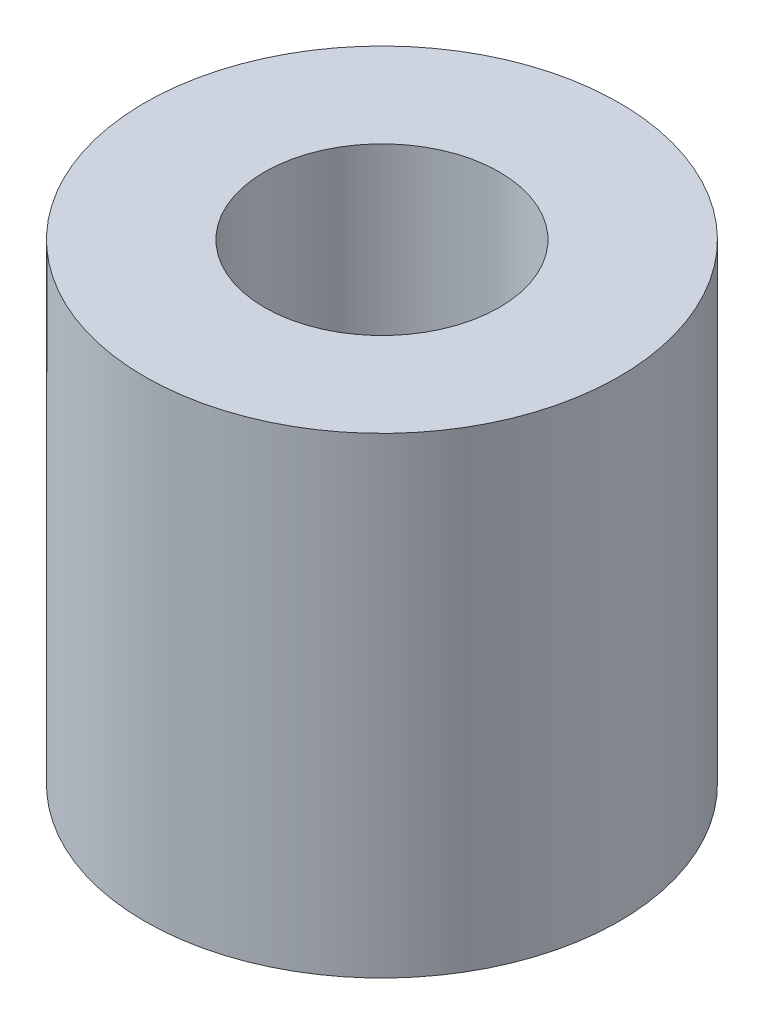
ISO-10303-21;
HEADER;
FILE_DESCRIPTION(('STEP AP214'),'2;1');
FILE_NAME('part.step','',(''),(''),'','','');
FILE_SCHEMA(('AUTOMOTIVE_DESIGN { 1 0 10303 214 1 1 1 1 }'));
ENDSEC;
DATA;
#1=APPLICATION_CONTEXT('core data for automotive mechanical design processes');
#2=APPLICATION_PROTOCOL_DEFINITION('international standard','automotive_design',2000,#1);
#3=PRODUCT_CONTEXT('',#1,'mechanical');
#4=PRODUCT('Part','Part','',(#3));
#5=PRODUCT_RELATED_PRODUCT_CATEGORY('part','',(#4));
#6=PRODUCT_DEFINITION_FORMATION('','',#4);
#7=PRODUCT_DEFINITION_CONTEXT('part definition',#1,'design');
#8=PRODUCT_DEFINITION('design','',#6,#7);
#9=PRODUCT_DEFINITION_SHAPE('','',#8);
#10=(LENGTH_UNIT() NAMED_UNIT(*) SI_UNIT(.MILLI.,.METRE.));
#11=(NAMED_UNIT(*) PLANE_ANGLE_UNIT() SI_UNIT($,.RADIAN.));
#12=(NAMED_UNIT(*) SI_UNIT($,.STERADIAN.) SOLID_ANGLE_UNIT());
#13=UNCERTAINTY_MEASURE_WITH_UNIT(LENGTH_MEASURE(1.E-05),#10,'distance_accuracy_value','');
#14=(GEOMETRIC_REPRESENTATION_CONTEXT(3) GLOBAL_UNCERTAINTY_ASSIGNED_CONTEXT((#13)) GLOBAL_UNIT_ASSIGNED_CONTEXT((#10,
#11,#12)) REPRESENTATION_CONTEXT('',''));
#15=CARTESIAN_POINT('',(0.,0.,0.));
#16=DIRECTION('',(0.,0.,1.));
#17=DIRECTION('',(1.,0.,0.));
#18=AXIS2_PLACEMENT_3D('',#15,#16,#17);
#19=CARTESIAN_POINT('',(0.,2.5,0.));
#20=DIRECTION('',(0.,1.,0.));
#21=DIRECTION('',(0.,0.,1.));
#22=AXIS2_PLACEMENT_3D('',#19,#20,#21);
#23=PLANE('',#22);
#24=CARTESIAN_POINT('',(0.,2.5,0.));
#25=DIRECTION('',(0.,1.,0.));
#26=DIRECTION('',(0.,0.,1.));
#27=AXIS2_PLACEMENT_3D('',#24,#25,#26);
#28=CIRCLE('',#27,2.5146);
#29=CARTESIAN_POINT('',(0.,2.5,2.5146));
#30=VERTEX_POINT('',#29);
#31=EDGE_CURVE('E10',#30,#30,#28,.T.);
#32=ORIENTED_EDGE('',*,*,#31,.T.);
#33=EDGE_LOOP('',(#32));
#34=FACE_BOUND('',#33,.T.);
#35=CARTESIAN_POINT('',(0.,2.5,0.));
#36=DIRECTION('',(0.,1.,0.));
#37=DIRECTION('',(0.,0.,1.));
#38=AXIS2_PLACEMENT_3D('',#35,#36,#37);
#39=CIRCLE('',#38,1.2446);
#40=CARTESIAN_POINT('',(0.,2.5,1.2446));
#41=VERTEX_POINT('',#40);
#42=EDGE_CURVE('E50',#41,#41,#39,.T.);
#43=ORIENTED_EDGE('',*,*,#42,.F.);
#44=EDGE_LOOP('',(#43));
#45=FACE_BOUND('',#44,.T.);
#46=ADVANCED_FACE('F37',(#34,#45),#23,.T.);
#47=CARTESIAN_POINT('',(0.,-2.5,0.));
#48=DIRECTION('',(0.,1.,0.));
#49=DIRECTION('',(0.,0.,1.));
#50=AXIS2_PLACEMENT_3D('',#47,#48,#49);
#51=PLANE('',#50);
#52=CARTESIAN_POINT('',(0.,-2.5,0.));
#53=DIRECTION('',(0.,1.,0.));
#54=DIRECTION('',(0.,0.,1.));
#55=AXIS2_PLACEMENT_3D('',#52,#53,#54);
#56=CIRCLE('',#55,2.5146);
#57=CARTESIAN_POINT('',(0.,-2.5,2.5146));
#58=VERTEX_POINT('',#57);
#59=EDGE_CURVE('E41',#58,#58,#56,.T.);
#60=ORIENTED_EDGE('',*,*,#59,.F.);
#61=EDGE_LOOP('',(#60));
#62=FACE_BOUND('',#61,.T.);
#63=CARTESIAN_POINT('',(0.,-2.5,0.));
#64=DIRECTION('',(0.,1.,0.));
#65=DIRECTION('',(0.,0.,1.));
#66=AXIS2_PLACEMENT_3D('',#63,#64,#65);
#67=CIRCLE('',#66,1.2446);
#68=CARTESIAN_POINT('',(0.,-2.5,1.2446));
#69=VERTEX_POINT('',#68);
#70=EDGE_CURVE('E52',#69,#69,#67,.T.);
#71=ORIENTED_EDGE('',*,*,#70,.T.);
#72=EDGE_LOOP('',(#71));
#73=FACE_BOUND('',#72,.T.);
#74=ADVANCED_FACE('F64',(#62,#73),#51,.F.);
#75=CARTESIAN_POINT('',(0.,2.5,0.));
#76=DIRECTION('',(0.,-1.,0.));
#77=DIRECTION('',(0.,0.,-1.));
#78=AXIS2_PLACEMENT_3D('',#75,#76,#77);
#79=CYLINDRICAL_SURFACE('',#78,2.5146);
#80=ORIENTED_EDGE('',*,*,#31,.F.);
#81=EDGE_LOOP('',(#80));
#82=FACE_BOUND('',#81,.T.);
#83=ORIENTED_EDGE('',*,*,#59,.T.);
#84=EDGE_LOOP('',(#83));
#85=FACE_BOUND('',#84,.T.);
#86=ADVANCED_FACE('F39',(#82,#85),#79,.T.);
#87=CARTESIAN_POINT('',(0.,2.5,0.));
#88=DIRECTION('',(0.,-1.,0.));
#89=DIRECTION('',(0.,0.,-1.));
#90=AXIS2_PLACEMENT_3D('',#87,#88,#89);
#91=CYLINDRICAL_SURFACE('',#90,1.2446);
#92=ORIENTED_EDGE('',*,*,#42,.T.);
#93=EDGE_LOOP('',(#92));
#94=FACE_BOUND('',#93,.T.);
#95=ORIENTED_EDGE('',*,*,#70,.F.);
#96=EDGE_LOOP('',(#95));
#97=FACE_BOUND('',#96,.T.);
#98=ADVANCED_FACE('F60',(#94,#97),#91,.F.);
#99=CLOSED_SHELL('',(#46,#74,#86,#98));
#100=MANIFOLD_SOLID_BREP('B2',#99);
#101=ADVANCED_BREP_SHAPE_REPRESENTATION('',(#18,#100),#14);
#102=SHAPE_DEFINITION_REPRESENTATION(#9,#101);
ENDSEC;
END-ISO-10303-21;
